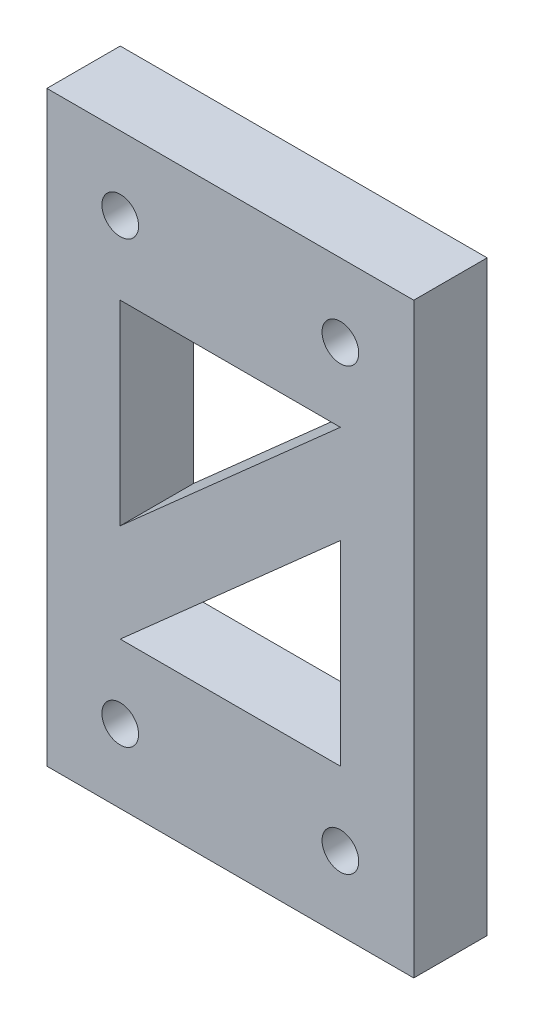
ISO-10303-21;
HEADER;
FILE_DESCRIPTION(('STEP AP214'),'2;1');
FILE_NAME('part.step','',(''),(''),'','','');
FILE_SCHEMA(('AUTOMOTIVE_DESIGN { 1 0 10303 214 1 1 1 1 }'));
ENDSEC;
DATA;
#1=APPLICATION_CONTEXT('core data for automotive mechanical design processes');
#2=APPLICATION_PROTOCOL_DEFINITION('international standard','automotive_design',2000,#1);
#3=PRODUCT_CONTEXT('',#1,'mechanical');
#4=PRODUCT('Part','Part','',(#3));
#5=PRODUCT_RELATED_PRODUCT_CATEGORY('part','',(#4));
#6=PRODUCT_DEFINITION_FORMATION('','',#4);
#7=PRODUCT_DEFINITION_CONTEXT('part definition',#1,'design');
#8=PRODUCT_DEFINITION('design','',#6,#7);
#9=PRODUCT_DEFINITION_SHAPE('','',#8);
#10=(LENGTH_UNIT() NAMED_UNIT(*) SI_UNIT(.MILLI.,.METRE.));
#11=(NAMED_UNIT(*) PLANE_ANGLE_UNIT() SI_UNIT($,.RADIAN.));
#12=(NAMED_UNIT(*) SI_UNIT($,.STERADIAN.) SOLID_ANGLE_UNIT());
#13=UNCERTAINTY_MEASURE_WITH_UNIT(LENGTH_MEASURE(1.E-05),#10,'distance_accuracy_value','');
#14=(GEOMETRIC_REPRESENTATION_CONTEXT(3) GLOBAL_UNCERTAINTY_ASSIGNED_CONTEXT((#13)) GLOBAL_UNIT_ASSIGNED_CONTEXT((#10,
#11,#12)) REPRESENTATION_CONTEXT('',''));
#15=CARTESIAN_POINT('',(0.,0.,0.));
#16=DIRECTION('',(0.,0.,1.));
#17=DIRECTION('',(1.,0.,0.));
#18=AXIS2_PLACEMENT_3D('',#15,#16,#17);
#19=CARTESIAN_POINT('',(0.,0.,-10.));
#20=DIRECTION('',(-1.,0.,0.));
#21=DIRECTION('',(0.,0.,1.));
#22=AXIS2_PLACEMENT_3D('',#19,#20,#21);
#23=PLANE('',#22);
#24=DIRECTION('',(0.,-1.,0.));
#25=VECTOR('',#24,1.);
#26=CARTESIAN_POINT('',(0.,0.,0.));
#27=LINE('',#26,#25);
#28=CARTESIAN_POINT('',(0.,80.,0.));
#29=VERTEX_POINT('',#28);
#30=CARTESIAN_POINT('',(0.,0.,0.));
#31=VERTEX_POINT('',#30);
#32=EDGE_CURVE('E178',#29,#31,#27,.T.);
#33=ORIENTED_EDGE('',*,*,#32,.F.);
#34=DIRECTION('',(0.,0.,1.));
#35=VECTOR('',#34,1.);
#36=CARTESIAN_POINT('',(0.,80.,-10.));
#37=LINE('',#36,#35);
#38=CARTESIAN_POINT('',(0.,80.,-10.));
#39=VERTEX_POINT('',#38);
#40=EDGE_CURVE('E11',#39,#29,#37,.T.);
#41=ORIENTED_EDGE('',*,*,#40,.F.);
#42=DIRECTION('',(0.,-1.,0.));
#43=VECTOR('',#42,1.);
#44=CARTESIAN_POINT('',(0.,0.,-10.));
#45=LINE('',#44,#43);
#46=CARTESIAN_POINT('',(0.,0.,-10.));
#47=VERTEX_POINT('',#46);
#48=EDGE_CURVE('E181',#39,#47,#45,.T.);
#49=ORIENTED_EDGE('',*,*,#48,.T.);
#50=DIRECTION('',(0.,0.,1.));
#51=VECTOR('',#50,1.);
#52=CARTESIAN_POINT('',(0.,0.,-10.));
#53=LINE('',#52,#51);
#54=EDGE_CURVE('E42',#47,#31,#53,.T.);
#55=ORIENTED_EDGE('',*,*,#54,.T.);
#56=EDGE_LOOP('',(#33,#41,#49,#55));
#57=FACE_BOUND('',#56,.T.);
#58=ADVANCED_FACE('F39',(#57),#23,.T.);
#59=CARTESIAN_POINT('',(0.,80.,-10.));
#60=DIRECTION('',(0.,1.,0.));
#61=DIRECTION('',(0.,0.,1.));
#62=AXIS2_PLACEMENT_3D('',#59,#60,#61);
#63=PLANE('',#62);
#64=DIRECTION('',(-1.,0.,0.));
#65=VECTOR('',#64,1.);
#66=CARTESIAN_POINT('',(0.,80.,0.));
#67=LINE('',#66,#65);
#68=CARTESIAN_POINT('',(50.,80.,0.));
#69=VERTEX_POINT('',#68);
#70=EDGE_CURVE('E185',#69,#29,#67,.T.);
#71=ORIENTED_EDGE('',*,*,#70,.F.);
#72=DIRECTION('',(0.,0.,1.));
#73=VECTOR('',#72,1.);
#74=CARTESIAN_POINT('',(50.,80.,-10.));
#75=LINE('',#74,#73);
#76=CARTESIAN_POINT('',(50.,80.,-10.));
#77=VERTEX_POINT('',#76);
#78=EDGE_CURVE('E47',#77,#69,#75,.T.);
#79=ORIENTED_EDGE('',*,*,#78,.F.);
#80=DIRECTION('',(-1.,0.,0.));
#81=VECTOR('',#80,1.);
#82=CARTESIAN_POINT('',(0.,80.,-10.));
#83=LINE('',#82,#81);
#84=EDGE_CURVE('E191',#77,#39,#83,.T.);
#85=ORIENTED_EDGE('',*,*,#84,.T.);
#86=ORIENTED_EDGE('',*,*,#40,.T.);
#87=EDGE_LOOP('',(#71,#79,#85,#86));
#88=FACE_BOUND('',#87,.T.);
#89=ADVANCED_FACE('F217',(#88),#63,.T.);
#90=CARTESIAN_POINT('',(50.,0.,-10.));
#91=DIRECTION('',(1.,0.,0.));
#92=DIRECTION('',(0.,0.,-1.));
#93=AXIS2_PLACEMENT_3D('',#90,#91,#92);
#94=PLANE('',#93);
#95=DIRECTION('',(0.,1.,0.));
#96=VECTOR('',#95,1.);
#97=CARTESIAN_POINT('',(50.,0.,0.));
#98=LINE('',#97,#96);
#99=CARTESIAN_POINT('',(50.,0.,0.));
#100=VERTEX_POINT('',#99);
#101=EDGE_CURVE('E199',#100,#69,#98,.T.);
#102=ORIENTED_EDGE('',*,*,#101,.F.);
#103=DIRECTION('',(0.,0.,1.));
#104=VECTOR('',#103,1.);
#105=CARTESIAN_POINT('',(50.,0.,-10.));
#106=LINE('',#105,#104);
#107=CARTESIAN_POINT('',(50.,0.,-10.));
#108=VERTEX_POINT('',#107);
#109=EDGE_CURVE('E204',#108,#100,#106,.T.);
#110=ORIENTED_EDGE('',*,*,#109,.F.);
#111=DIRECTION('',(0.,1.,0.));
#112=VECTOR('',#111,1.);
#113=CARTESIAN_POINT('',(50.,0.,-10.));
#114=LINE('',#113,#112);
#115=EDGE_CURVE('E188',#108,#77,#114,.T.);
#116=ORIENTED_EDGE('',*,*,#115,.T.);
#117=ORIENTED_EDGE('',*,*,#78,.T.);
#118=EDGE_LOOP('',(#102,#110,#116,#117));
#119=FACE_BOUND('',#118,.T.);
#120=ADVANCED_FACE('F222',(#119),#94,.T.);
#121=CARTESIAN_POINT('',(0.,0.,-10.));
#122=DIRECTION('',(0.,-1.,0.));
#123=DIRECTION('',(0.,0.,-1.));
#124=AXIS2_PLACEMENT_3D('',#121,#122,#123);
#125=PLANE('',#124);
#126=DIRECTION('',(1.,0.,0.));
#127=VECTOR('',#126,1.);
#128=CARTESIAN_POINT('',(0.,0.,0.));
#129=LINE('',#128,#127);
#130=EDGE_CURVE('E196',#31,#100,#129,.T.);
#131=ORIENTED_EDGE('',*,*,#130,.F.);
#132=ORIENTED_EDGE('',*,*,#54,.F.);
#133=DIRECTION('',(1.,0.,0.));
#134=VECTOR('',#133,1.);
#135=CARTESIAN_POINT('',(0.,0.,-10.));
#136=LINE('',#135,#134);
#137=EDGE_CURVE('E184',#47,#108,#136,.T.);
#138=ORIENTED_EDGE('',*,*,#137,.T.);
#139=ORIENTED_EDGE('',*,*,#109,.T.);
#140=EDGE_LOOP('',(#131,#132,#138,#139));
#141=FACE_BOUND('',#140,.T.);
#142=ADVANCED_FACE('F212',(#141),#125,.T.);
#143=CARTESIAN_POINT('',(0.,0.,-10.));
#144=DIRECTION('',(0.,0.,-1.));
#145=DIRECTION('',(-1.,0.,0.));
#146=AXIS2_PLACEMENT_3D('',#143,#144,#145);
#147=PLANE('',#146);
#148=CARTESIAN_POINT('',(40.,9.99999999999999,-10.));
#149=DIRECTION('',(0.,0.,-1.));
#150=DIRECTION('',(-1.,0.,0.));
#151=AXIS2_PLACEMENT_3D('',#148,#149,#150);
#152=CIRCLE('',#151,2.5);
#153=CARTESIAN_POINT('',(37.5,9.99999999999999,-10.));
#154=VERTEX_POINT('',#153);
#155=EDGE_CURVE('E402',#154,#154,#152,.F.);
#156=ORIENTED_EDGE('',*,*,#155,.T.);
#157=EDGE_LOOP('',(#156));
#158=FACE_BOUND('',#157,.T.);
#159=CARTESIAN_POINT('',(10.,70.,-10.));
#160=DIRECTION('',(0.,0.,-1.));
#161=DIRECTION('',(-1.,0.,0.));
#162=AXIS2_PLACEMENT_3D('',#159,#160,#161);
#163=CIRCLE('',#162,2.5);
#164=CARTESIAN_POINT('',(7.50000000000001,70.,-10.));
#165=VERTEX_POINT('',#164);
#166=EDGE_CURVE('E406',#165,#165,#163,.F.);
#167=ORIENTED_EDGE('',*,*,#166,.T.);
#168=EDGE_LOOP('',(#167));
#169=FACE_BOUND('',#168,.T.);
#170=DIRECTION('',(0.,-1.,0.));
#171=VECTOR('',#170,1.);
#172=CARTESIAN_POINT('',(10.,33.3711730708738,-10.));
#173=LINE('',#172,#171);
#174=CARTESIAN_POINT('',(10.,60.,-10.));
#175=VERTEX_POINT('',#174);
#176=CARTESIAN_POINT('',(10.,33.3711730708738,-10.));
#177=VERTEX_POINT('',#176);
#178=EDGE_CURVE('E126',#175,#177,#173,.T.);
#179=ORIENTED_EDGE('',*,*,#178,.T.);
#180=DIRECTION('',(0.747877538267963,0.663836717690617,0.));
#181=VECTOR('',#180,1.);
#182=CARTESIAN_POINT('',(40.,60.,-10.));
#183=LINE('',#182,#181);
#184=CARTESIAN_POINT('',(40.,60.,-10.));
#185=VERTEX_POINT('',#184);
#186=EDGE_CURVE('E115',#177,#185,#183,.T.);
#187=ORIENTED_EDGE('',*,*,#186,.T.);
#188=DIRECTION('',(-1.,0.,0.));
#189=VECTOR('',#188,1.);
#190=CARTESIAN_POINT('',(10.,60.,-10.));
#191=LINE('',#190,#189);
#192=EDGE_CURVE('E132',#185,#175,#191,.T.);
#193=ORIENTED_EDGE('',*,*,#192,.T.);
#194=EDGE_LOOP('',(#179,#187,#193));
#195=FACE_BOUND('',#194,.T.);
#196=DIRECTION('',(-0.747877538267963,-0.663836717690617,0.));
#197=VECTOR('',#196,1.);
#198=CARTESIAN_POINT('',(10.,20.,-10.));
#199=LINE('',#198,#197);
#200=CARTESIAN_POINT('',(40.,46.6288269291262,-10.));
#201=VERTEX_POINT('',#200);
#202=CARTESIAN_POINT('',(10.,20.,-10.));
#203=VERTEX_POINT('',#202);
#204=EDGE_CURVE('E147',#201,#203,#199,.T.);
#205=ORIENTED_EDGE('',*,*,#204,.T.);
#206=DIRECTION('',(1.,0.,0.));
#207=VECTOR('',#206,1.);
#208=CARTESIAN_POINT('',(40.,20.,-10.));
#209=LINE('',#208,#207);
#210=CARTESIAN_POINT('',(40.,20.,-10.));
#211=VERTEX_POINT('',#210);
#212=EDGE_CURVE('E161',#203,#211,#209,.T.);
#213=ORIENTED_EDGE('',*,*,#212,.T.);
#214=DIRECTION('',(0.,1.,0.));
#215=VECTOR('',#214,1.);
#216=CARTESIAN_POINT('',(40.,46.6288269291262,-10.));
#217=LINE('',#216,#215);
#218=EDGE_CURVE('E122',#211,#201,#217,.T.);
#219=ORIENTED_EDGE('',*,*,#218,.T.);
#220=EDGE_LOOP('',(#205,#213,#219));
#221=FACE_BOUND('',#220,.T.);
#222=CARTESIAN_POINT('',(10.,10.,-10.));
#223=DIRECTION('',(0.,0.,-1.));
#224=DIRECTION('',(-1.,0.,0.));
#225=AXIS2_PLACEMENT_3D('',#222,#223,#224);
#226=CIRCLE('',#225,2.5);
#227=CARTESIAN_POINT('',(7.50000000000001,10.,-10.));
#228=VERTEX_POINT('',#227);
#229=EDGE_CURVE('E168',#228,#228,#226,.F.);
#230=ORIENTED_EDGE('',*,*,#229,.T.);
#231=EDGE_LOOP('',(#230));
#232=FACE_BOUND('',#231,.T.);
#233=CARTESIAN_POINT('',(40.,70.,-10.));
#234=DIRECTION('',(0.,0.,-1.));
#235=DIRECTION('',(-1.,0.,0.));
#236=AXIS2_PLACEMENT_3D('',#233,#234,#235);
#237=CIRCLE('',#236,2.5);
#238=CARTESIAN_POINT('',(37.5,70.,-10.));
#239=VERTEX_POINT('',#238);
#240=EDGE_CURVE('E172',#239,#239,#237,.F.);
#241=ORIENTED_EDGE('',*,*,#240,.T.);
#242=EDGE_LOOP('',(#241));
#243=FACE_BOUND('',#242,.T.);
#244=ORIENTED_EDGE('',*,*,#48,.F.);
#245=ORIENTED_EDGE('',*,*,#84,.F.);
#246=ORIENTED_EDGE('',*,*,#115,.F.);
#247=ORIENTED_EDGE('',*,*,#137,.F.);
#248=EDGE_LOOP('',(#244,#245,#246,#247));
#249=FACE_BOUND('',#248,.T.);
#250=ADVANCED_FACE('F130',(#158,#169,#195,#221,#232,#243,#249),#147,.T.);
#251=CARTESIAN_POINT('',(0.,0.,0.));
#252=DIRECTION('',(0.,0.,-1.));
#253=DIRECTION('',(-1.,0.,0.));
#254=AXIS2_PLACEMENT_3D('',#251,#252,#253);
#255=PLANE('',#254);
#256=CARTESIAN_POINT('',(40.,9.99999999999999,0.));
#257=DIRECTION('',(0.,0.,1.));
#258=DIRECTION('',(-1.,0.,0.));
#259=AXIS2_PLACEMENT_3D('',#256,#257,#258);
#260=CIRCLE('',#259,2.5);
#261=CARTESIAN_POINT('',(37.5,9.99999999999999,0.));
#262=VERTEX_POINT('',#261);
#263=EDGE_CURVE('E405',#262,#262,#260,.T.);
#264=ORIENTED_EDGE('',*,*,#263,.F.);
#265=EDGE_LOOP('',(#264));
#266=FACE_BOUND('',#265,.T.);
#267=CARTESIAN_POINT('',(10.,70.,0.));
#268=DIRECTION('',(0.,0.,1.));
#269=DIRECTION('',(-1.,0.,0.));
#270=AXIS2_PLACEMENT_3D('',#267,#268,#269);
#271=CIRCLE('',#270,2.5);
#272=CARTESIAN_POINT('',(7.50000000000001,70.,0.));
#273=VERTEX_POINT('',#272);
#274=EDGE_CURVE('E136',#273,#273,#271,.T.);
#275=ORIENTED_EDGE('',*,*,#274,.F.);
#276=EDGE_LOOP('',(#275));
#277=FACE_BOUND('',#276,.T.);
#278=DIRECTION('',(0.747877538267963,0.663836717690617,0.));
#279=VECTOR('',#278,1.);
#280=CARTESIAN_POINT('',(40.,60.,0.));
#281=LINE('',#280,#279);
#282=CARTESIAN_POINT('',(10.,33.3711730708738,0.));
#283=VERTEX_POINT('',#282);
#284=CARTESIAN_POINT('',(40.,60.,0.));
#285=VERTEX_POINT('',#284);
#286=EDGE_CURVE('E134',#283,#285,#281,.T.);
#287=ORIENTED_EDGE('',*,*,#286,.F.);
#288=DIRECTION('',(0.,-1.,0.));
#289=VECTOR('',#288,1.);
#290=CARTESIAN_POINT('',(10.,33.3711730708738,0.));
#291=LINE('',#290,#289);
#292=CARTESIAN_POINT('',(10.,60.,0.));
#293=VERTEX_POINT('',#292);
#294=EDGE_CURVE('E63',#293,#283,#291,.T.);
#295=ORIENTED_EDGE('',*,*,#294,.F.);
#296=DIRECTION('',(-1.,0.,0.));
#297=VECTOR('',#296,1.);
#298=CARTESIAN_POINT('',(10.,60.,0.));
#299=LINE('',#298,#297);
#300=EDGE_CURVE('E128',#285,#293,#299,.T.);
#301=ORIENTED_EDGE('',*,*,#300,.F.);
#302=EDGE_LOOP('',(#287,#295,#301));
#303=FACE_BOUND('',#302,.T.);
#304=DIRECTION('',(1.,0.,0.));
#305=VECTOR('',#304,1.);
#306=CARTESIAN_POINT('',(40.,20.,0.));
#307=LINE('',#306,#305);
#308=CARTESIAN_POINT('',(10.,20.,0.));
#309=VERTEX_POINT('',#308);
#310=CARTESIAN_POINT('',(40.,20.,0.));
#311=VERTEX_POINT('',#310);
#312=EDGE_CURVE('E152',#309,#311,#307,.T.);
#313=ORIENTED_EDGE('',*,*,#312,.F.);
#314=DIRECTION('',(-0.747877538267963,-0.663836717690617,0.));
#315=VECTOR('',#314,1.);
#316=CARTESIAN_POINT('',(10.,20.,0.));
#317=LINE('',#316,#315);
#318=CARTESIAN_POINT('',(40.,46.6288269291262,0.));
#319=VERTEX_POINT('',#318);
#320=EDGE_CURVE('E150',#319,#309,#317,.T.);
#321=ORIENTED_EDGE('',*,*,#320,.F.);
#322=DIRECTION('',(0.,1.,0.));
#323=VECTOR('',#322,1.);
#324=CARTESIAN_POINT('',(40.,46.6288269291262,0.));
#325=LINE('',#324,#323);
#326=EDGE_CURVE('E155',#311,#319,#325,.T.);
#327=ORIENTED_EDGE('',*,*,#326,.F.);
#328=EDGE_LOOP('',(#313,#321,#327));
#329=FACE_BOUND('',#328,.T.);
#330=CARTESIAN_POINT('',(10.,10.,0.));
#331=DIRECTION('',(0.,0.,1.));
#332=DIRECTION('',(1.,0.,0.));
#333=AXIS2_PLACEMENT_3D('',#330,#331,#332);
#334=CIRCLE('',#333,2.5);
#335=CARTESIAN_POINT('',(12.5,10.,0.));
#336=VERTEX_POINT('',#335);
#337=EDGE_CURVE('E169',#336,#336,#334,.T.);
#338=ORIENTED_EDGE('',*,*,#337,.F.);
#339=EDGE_LOOP('',(#338));
#340=FACE_BOUND('',#339,.T.);
#341=CARTESIAN_POINT('',(40.,70.,0.));
#342=DIRECTION('',(0.,0.,1.));
#343=DIRECTION('',(1.,0.,0.));
#344=AXIS2_PLACEMENT_3D('',#341,#342,#343);
#345=CIRCLE('',#344,2.5);
#346=CARTESIAN_POINT('',(42.5,70.,0.));
#347=VERTEX_POINT('',#346);
#348=EDGE_CURVE('E175',#347,#347,#345,.T.);
#349=ORIENTED_EDGE('',*,*,#348,.F.);
#350=EDGE_LOOP('',(#349));
#351=FACE_BOUND('',#350,.T.);
#352=ORIENTED_EDGE('',*,*,#32,.T.);
#353=ORIENTED_EDGE('',*,*,#130,.T.);
#354=ORIENTED_EDGE('',*,*,#101,.T.);
#355=ORIENTED_EDGE('',*,*,#70,.T.);
#356=EDGE_LOOP('',(#352,#353,#354,#355));
#357=FACE_BOUND('',#356,.T.);
#358=ADVANCED_FACE('F214',(#266,#277,#303,#329,#340,#351,#357),#255,.F.);
#359=CARTESIAN_POINT('',(40.,70.,-10.001));
#360=DIRECTION('',(0.,0.,1.));
#361=DIRECTION('',(1.,0.,0.));
#362=AXIS2_PLACEMENT_3D('',#359,#360,#361);
#363=CYLINDRICAL_SURFACE('',#362,2.5);
#364=ORIENTED_EDGE('',*,*,#240,.F.);
#365=EDGE_LOOP('',(#364));
#366=FACE_BOUND('',#365,.T.);
#367=ORIENTED_EDGE('',*,*,#348,.T.);
#368=EDGE_LOOP('',(#367));
#369=FACE_BOUND('',#368,.T.);
#370=ADVANCED_FACE('F269',(#366,#369),#363,.F.);
#371=CARTESIAN_POINT('',(10.,10.,-10.001));
#372=DIRECTION('',(0.,0.,1.));
#373=DIRECTION('',(1.,0.,0.));
#374=AXIS2_PLACEMENT_3D('',#371,#372,#373);
#375=CYLINDRICAL_SURFACE('',#374,2.5);
#376=ORIENTED_EDGE('',*,*,#229,.F.);
#377=EDGE_LOOP('',(#376));
#378=FACE_BOUND('',#377,.T.);
#379=ORIENTED_EDGE('',*,*,#337,.T.);
#380=EDGE_LOOP('',(#379));
#381=FACE_BOUND('',#380,.T.);
#382=ADVANCED_FACE('F280',(#378,#381),#375,.F.);
#383=CARTESIAN_POINT('',(10.,20.,-10.001));
#384=DIRECTION('',(-0.663836717690617,0.747877538267963,0.));
#385=DIRECTION('',(-0.747877538267963,-0.663836717690617,0.));
#386=AXIS2_PLACEMENT_3D('',#383,#384,#385);
#387=PLANE('',#386);
#388=DIRECTION('',(0.,0.,1.));
#389=VECTOR('',#388,1.);
#390=CARTESIAN_POINT('',(40.,46.6288269291262,-10.001));
#391=LINE('',#390,#389);
#392=EDGE_CURVE('E159',#201,#319,#391,.T.);
#393=ORIENTED_EDGE('',*,*,#392,.T.);
#394=ORIENTED_EDGE('',*,*,#320,.T.);
#395=DIRECTION('',(0.,0.,1.));
#396=VECTOR('',#395,1.);
#397=CARTESIAN_POINT('',(10.,20.,-10.001));
#398=LINE('',#397,#396);
#399=EDGE_CURVE('E158',#203,#309,#398,.T.);
#400=ORIENTED_EDGE('',*,*,#399,.F.);
#401=ORIENTED_EDGE('',*,*,#204,.F.);
#402=EDGE_LOOP('',(#393,#394,#400,#401));
#403=FACE_BOUND('',#402,.T.);
#404=ADVANCED_FACE('F291',(#403),#387,.F.);
#405=CARTESIAN_POINT('',(40.,46.6288269291262,-10.001));
#406=DIRECTION('',(1.,0.,0.));
#407=DIRECTION('',(0.,1.,0.));
#408=AXIS2_PLACEMENT_3D('',#405,#406,#407);
#409=PLANE('',#408);
#410=DIRECTION('',(0.,0.,1.));
#411=VECTOR('',#410,1.);
#412=CARTESIAN_POINT('',(40.,20.,-10.001));
#413=LINE('',#412,#411);
#414=EDGE_CURVE('E162',#211,#311,#413,.T.);
#415=ORIENTED_EDGE('',*,*,#414,.T.);
#416=ORIENTED_EDGE('',*,*,#326,.T.);
#417=ORIENTED_EDGE('',*,*,#392,.F.);
#418=ORIENTED_EDGE('',*,*,#218,.F.);
#419=EDGE_LOOP('',(#415,#416,#417,#418));
#420=FACE_BOUND('',#419,.T.);
#421=ADVANCED_FACE('F302',(#420),#409,.F.);
#422=CARTESIAN_POINT('',(40.,20.,-10.001));
#423=DIRECTION('',(0.,-1.,0.));
#424=DIRECTION('',(1.,0.,0.));
#425=AXIS2_PLACEMENT_3D('',#422,#423,#424);
#426=PLANE('',#425);
#427=ORIENTED_EDGE('',*,*,#399,.T.);
#428=ORIENTED_EDGE('',*,*,#312,.T.);
#429=ORIENTED_EDGE('',*,*,#414,.F.);
#430=ORIENTED_EDGE('',*,*,#212,.F.);
#431=EDGE_LOOP('',(#427,#428,#429,#430));
#432=FACE_BOUND('',#431,.T.);
#433=ADVANCED_FACE('F313',(#432),#426,.F.);
#434=CARTESIAN_POINT('',(10.,33.3711730708738,-10.001));
#435=DIRECTION('',(-1.,0.,0.));
#436=DIRECTION('',(0.,0.,1.));
#437=AXIS2_PLACEMENT_3D('',#434,#435,#436);
#438=PLANE('',#437);
#439=DIRECTION('',(0.,0.,1.));
#440=VECTOR('',#439,1.);
#441=CARTESIAN_POINT('',(10.,60.,-10.001));
#442=LINE('',#441,#440);
#443=EDGE_CURVE('E123',#175,#293,#442,.T.);
#444=ORIENTED_EDGE('',*,*,#443,.T.);
#445=ORIENTED_EDGE('',*,*,#294,.T.);
#446=DIRECTION('',(0.,0.,1.));
#447=VECTOR('',#446,1.);
#448=CARTESIAN_POINT('',(10.,33.3711730708738,-10.001));
#449=LINE('',#448,#447);
#450=EDGE_CURVE('E117',#177,#283,#449,.T.);
#451=ORIENTED_EDGE('',*,*,#450,.F.);
#452=ORIENTED_EDGE('',*,*,#178,.F.);
#453=EDGE_LOOP('',(#444,#445,#451,#452));
#454=FACE_BOUND('',#453,.T.);
#455=ADVANCED_FACE('F125',(#454),#438,.F.);
#456=CARTESIAN_POINT('',(10.,60.,-10.001));
#457=DIRECTION('',(0.,1.,0.));
#458=DIRECTION('',(-1.,0.,0.));
#459=AXIS2_PLACEMENT_3D('',#456,#457,#458);
#460=PLANE('',#459);
#461=DIRECTION('',(0.,0.,1.));
#462=VECTOR('',#461,1.);
#463=CARTESIAN_POINT('',(40.,60.,-10.001));
#464=LINE('',#463,#462);
#465=EDGE_CURVE('E55',#185,#285,#464,.T.);
#466=ORIENTED_EDGE('',*,*,#465,.T.);
#467=ORIENTED_EDGE('',*,*,#300,.T.);
#468=ORIENTED_EDGE('',*,*,#443,.F.);
#469=ORIENTED_EDGE('',*,*,#192,.F.);
#470=EDGE_LOOP('',(#466,#467,#468,#469));
#471=FACE_BOUND('',#470,.T.);
#472=ADVANCED_FACE('F334',(#471),#460,.F.);
#473=CARTESIAN_POINT('',(40.,60.,-10.001));
#474=DIRECTION('',(0.663836717690617,-0.747877538267963,0.));
#475=DIRECTION('',(0.747877538267963,0.663836717690617,0.));
#476=AXIS2_PLACEMENT_3D('',#473,#474,#475);
#477=PLANE('',#476);
#478=ORIENTED_EDGE('',*,*,#450,.T.);
#479=ORIENTED_EDGE('',*,*,#286,.T.);
#480=ORIENTED_EDGE('',*,*,#465,.F.);
#481=ORIENTED_EDGE('',*,*,#186,.F.);
#482=EDGE_LOOP('',(#478,#479,#480,#481));
#483=FACE_BOUND('',#482,.T.);
#484=ADVANCED_FACE('F116',(#483),#477,.F.);
#485=CARTESIAN_POINT('',(10.,70.,-10.001));
#486=DIRECTION('',(0.,0.,1.));
#487=DIRECTION('',(1.,0.,0.));
#488=AXIS2_PLACEMENT_3D('',#485,#486,#487);
#489=CYLINDRICAL_SURFACE('',#488,2.5);
#490=ORIENTED_EDGE('',*,*,#166,.F.);
#491=EDGE_LOOP('',(#490));
#492=FACE_BOUND('',#491,.T.);
#493=ORIENTED_EDGE('',*,*,#274,.T.);
#494=EDGE_LOOP('',(#493));
#495=FACE_BOUND('',#494,.T.);
#496=ADVANCED_FACE('F354',(#492,#495),#489,.F.);
#497=CARTESIAN_POINT('',(40.,9.99999999999999,-10.001));
#498=DIRECTION('',(0.,0.,1.));
#499=DIRECTION('',(1.,0.,0.));
#500=AXIS2_PLACEMENT_3D('',#497,#498,#499);
#501=CYLINDRICAL_SURFACE('',#500,2.5);
#502=ORIENTED_EDGE('',*,*,#155,.F.);
#503=EDGE_LOOP('',(#502));
#504=FACE_BOUND('',#503,.T.);
#505=ORIENTED_EDGE('',*,*,#263,.T.);
#506=EDGE_LOOP('',(#505));
#507=FACE_BOUND('',#506,.T.);
#508=ADVANCED_FACE('F364',(#504,#507),#501,.F.);
#509=CLOSED_SHELL('',(#58,#89,#120,#142,#250,#358,#370,#382,#404,#421,#433,#455,#472,#484,#496,#508));
#510=MANIFOLD_SOLID_BREP('B2',#509);
#511=ADVANCED_BREP_SHAPE_REPRESENTATION('',(#18,#510),#14);
#512=SHAPE_DEFINITION_REPRESENTATION(#9,#511);
ENDSEC;
END-ISO-10303-21;
